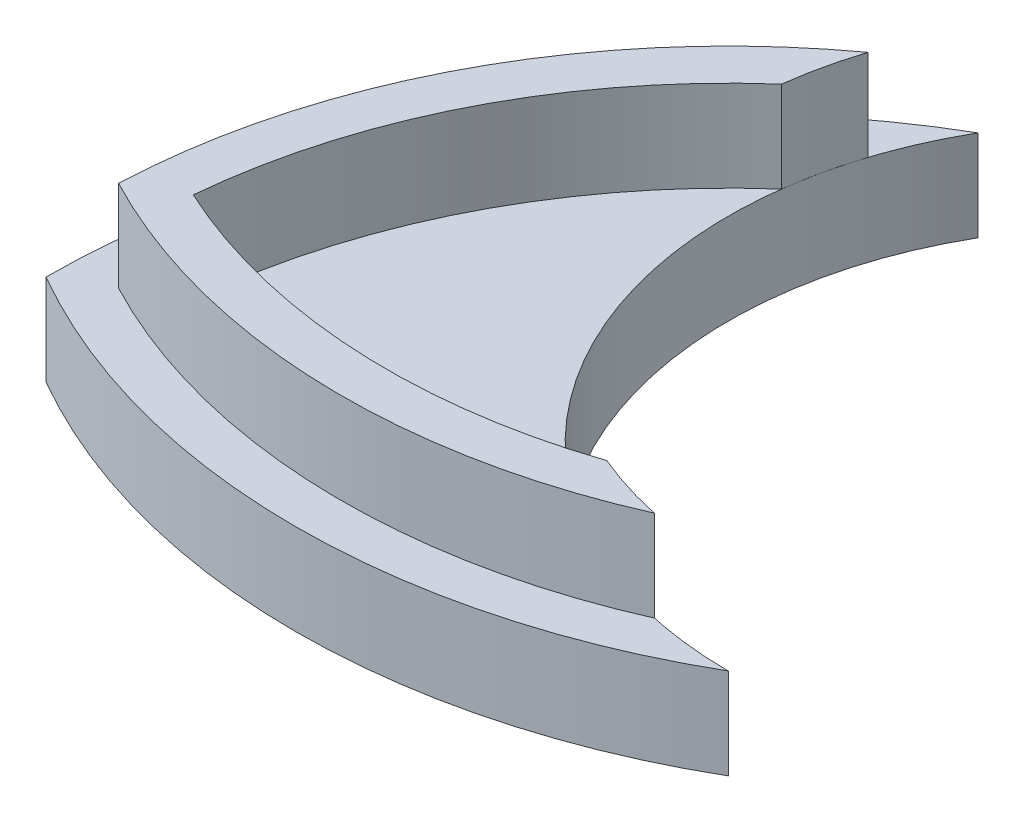
ISO-10303-21;
HEADER;
FILE_DESCRIPTION(('STEP AP214'),'2;1');
FILE_NAME('part.step','',(''),(''),'','','');
FILE_SCHEMA(('AUTOMOTIVE_DESIGN { 1 0 10303 214 1 1 1 1 }'));
ENDSEC;
DATA;
#1=APPLICATION_CONTEXT('core data for automotive mechanical design processes');
#2=APPLICATION_PROTOCOL_DEFINITION('international standard','automotive_design',2000,#1);
#3=PRODUCT_CONTEXT('',#1,'mechanical');
#4=PRODUCT('Part','Part','',(#3));
#5=PRODUCT_RELATED_PRODUCT_CATEGORY('part','',(#4));
#6=PRODUCT_DEFINITION_FORMATION('','',#4);
#7=PRODUCT_DEFINITION_CONTEXT('part definition',#1,'design');
#8=PRODUCT_DEFINITION('design','',#6,#7);
#9=PRODUCT_DEFINITION_SHAPE('','',#8);
#10=(LENGTH_UNIT() NAMED_UNIT(*) SI_UNIT(.MILLI.,.METRE.));
#11=(NAMED_UNIT(*) PLANE_ANGLE_UNIT() SI_UNIT($,.RADIAN.));
#12=(NAMED_UNIT(*) SI_UNIT($,.STERADIAN.) SOLID_ANGLE_UNIT());
#13=UNCERTAINTY_MEASURE_WITH_UNIT(LENGTH_MEASURE(1.E-05),#10,'distance_accuracy_value','');
#14=(GEOMETRIC_REPRESENTATION_CONTEXT(3) GLOBAL_UNCERTAINTY_ASSIGNED_CONTEXT((#13)) GLOBAL_UNIT_ASSIGNED_CONTEXT((#10,
#11,#12)) REPRESENTATION_CONTEXT('',''));
#15=CARTESIAN_POINT('',(0.,0.,0.));
#16=DIRECTION('',(0.,0.,1.));
#17=DIRECTION('',(1.,0.,0.));
#18=AXIS2_PLACEMENT_3D('',#15,#16,#17);
#19=CARTESIAN_POINT('',(-23.1873987103901,3.,-69.6040107675851));
#20=DIRECTION('',(0.,-1.,0.));
#21=DIRECTION('',(0.,0.,-1.));
#22=AXIS2_PLACEMENT_3D('',#19,#20,#21);
#23=PLANE('',#22);
#24=CARTESIAN_POINT('',(0.,3.,-50.094010767585));
#25=DIRECTION('',(0.,1.,0.));
#26=DIRECTION('',(0.,0.,1.));
#27=AXIS2_PLACEMENT_3D('',#24,#25,#26);
#28=CIRCLE('',#27,21.0166604983954);
#29=CARTESIAN_POINT('',(-12.3730420220271,3.,-67.0824730177702));
#30=VERTEX_POINT('',#29);
#31=CARTESIAN_POINT('',(-20.9983718015425,3.,-50.9705951554206));
#32=VERTEX_POINT('',#31);
#33=EDGE_CURVE('E133',#30,#32,#28,.T.);
#34=ORIENTED_EDGE('',*,*,#33,.F.);
#35=CARTESIAN_POINT('',(0.,3.,-63.0940107675848));
#36=DIRECTION('',(0.,-1.,0.));
#37=DIRECTION('',(0.,0.,-1.));
#38=AXIS2_PLACEMENT_3D('',#35,#36,#37);
#39=CIRCLE('',#38,13.);
#40=CARTESIAN_POINT('',(-12.8948631362501,3.,-64.7440121910322));
#41=VERTEX_POINT('',#40);
#42=EDGE_CURVE('E129',#30,#41,#39,.F.);
#43=ORIENTED_EDGE('',*,*,#42,.T.);
#44=CARTESIAN_POINT('',(0.,3.,-50.094010767585));
#45=DIRECTION('',(0.,1.,0.));
#46=DIRECTION('',(0.,0.,1.));
#47=AXIS2_PLACEMENT_3D('',#44,#45,#46);
#48=CIRCLE('',#47,19.5166604983954);
#49=CARTESIAN_POINT('',(-19.4354147151727,3.,-51.872968849968));
#50=VERTEX_POINT('',#49);
#51=EDGE_CURVE('E61',#41,#50,#48,.T.);
#52=ORIENTED_EDGE('',*,*,#51,.T.);
#53=CARTESIAN_POINT('',(-11.2583302491977,3.,-69.594010767585));
#54=DIRECTION('',(0.,1.,0.));
#55=DIRECTION('',(0.,0.,1.));
#56=AXIS2_PLACEMENT_3D('',#53,#54,#55);
#57=CIRCLE('',#56,19.5166604983954);
#58=CARTESIAN_POINT('',(-5.01848841913956,3.,-51.1017310015452));
#59=VERTEX_POINT('',#58);
#60=EDGE_CURVE('E117',#50,#59,#57,.T.);
#61=ORIENTED_EDGE('',*,*,#60,.T.);
#62=CARTESIAN_POINT('',(-2.73241138031828,3.,-50.3844109293245));
#63=VERTEX_POINT('',#62);
#64=EDGE_CURVE('E125',#59,#63,#39,.F.);
#65=ORIENTED_EDGE('',*,*,#64,.T.);
#66=CARTESIAN_POINT('',(-11.2583302491977,3.,-69.594010767585));
#67=DIRECTION('',(0.,1.,0.));
#68=DIRECTION('',(0.,0.,1.));
#69=AXIS2_PLACEMENT_3D('',#66,#67,#68);
#70=CIRCLE('',#69,21.0166604983954);
#71=EDGE_CURVE('E136',#32,#63,#70,.T.);
#72=ORIENTED_EDGE('',*,*,#71,.F.);
#73=EDGE_LOOP('',(#34,#43,#52,#61,#65,#72));
#74=FACE_BOUND('',#73,.T.);
#75=ADVANCED_FACE('F57',(#74),#23,.T.);
#76=CARTESIAN_POINT('',(0.,6.,-50.094010767585));
#77=DIRECTION('',(0.,-1.,0.));
#78=DIRECTION('',(0.,0.,-1.));
#79=AXIS2_PLACEMENT_3D('',#76,#77,#78);
#80=CYLINDRICAL_SURFACE('',#79,21.0166604983954);
#81=CARTESIAN_POINT('',(0.,6.,-50.094010767585));
#82=DIRECTION('',(0.,1.,0.));
#83=DIRECTION('',(0.,0.,1.));
#84=AXIS2_PLACEMENT_3D('',#81,#82,#83);
#85=CIRCLE('',#84,21.0166604983954);
#86=CARTESIAN_POINT('',(-12.3730420220271,6.,-67.0824730177702));
#87=VERTEX_POINT('',#86);
#88=CARTESIAN_POINT('',(-20.9983718015425,6.,-50.9705951554206));
#89=VERTEX_POINT('',#88);
#90=EDGE_CURVE('E139',#87,#89,#85,.T.);
#91=ORIENTED_EDGE('',*,*,#90,.F.);
#92=DIRECTION('',(0.,1.,0.));
#93=VECTOR('',#92,1.);
#94=CARTESIAN_POINT('',(-12.3730420220271,-3.005,-67.0824730177702));
#95=LINE('',#94,#93);
#96=EDGE_CURVE('E121',#87,#30,#95,.F.);
#97=ORIENTED_EDGE('',*,*,#96,.T.);
#98=ORIENTED_EDGE('',*,*,#33,.T.);
#99=DIRECTION('',(0.,-1.,0.));
#100=VECTOR('',#99,1.);
#101=CARTESIAN_POINT('',(-20.9983718015425,6.,-50.9705951554206));
#102=LINE('',#101,#100);
#103=EDGE_CURVE('E141',#89,#32,#102,.T.);
#104=ORIENTED_EDGE('',*,*,#103,.F.);
#105=EDGE_LOOP('',(#91,#97,#98,#104));
#106=FACE_BOUND('',#105,.T.);
#107=ADVANCED_FACE('F168',(#106),#80,.T.);
#108=CARTESIAN_POINT('',(0.,-12.01,-63.0940107675848));
#109=DIRECTION('',(0.,1.,0.));
#110=DIRECTION('',(0.,0.,1.));
#111=AXIS2_PLACEMENT_3D('',#108,#109,#110);
#112=CYLINDRICAL_SURFACE('',#111,13.);
#113=ORIENTED_EDGE('',*,*,#42,.F.);
#114=ORIENTED_EDGE('',*,*,#96,.F.);
#115=CARTESIAN_POINT('',(0.,6.,-63.0940107675848));
#116=DIRECTION('',(0.,1.,0.));
#117=DIRECTION('',(0.,0.,1.));
#118=AXIS2_PLACEMENT_3D('',#115,#116,#117);
#119=CIRCLE('',#118,13.);
#120=CARTESIAN_POINT('',(-12.8948631362501,6.,-64.7440121910322));
#121=VERTEX_POINT('',#120);
#122=EDGE_CURVE('E66',#87,#121,#119,.T.);
#123=ORIENTED_EDGE('',*,*,#122,.T.);
#124=DIRECTION('',(0.,1.,0.));
#125=VECTOR('',#124,1.);
#126=CARTESIAN_POINT('',(-12.8948631362501,-3.005,-64.7440121910322));
#127=LINE('',#126,#125);
#128=EDGE_CURVE('E80',#121,#41,#127,.F.);
#129=ORIENTED_EDGE('',*,*,#128,.T.);
#130=EDGE_LOOP('',(#113,#114,#123,#129));
#131=FACE_BOUND('',#130,.T.);
#132=ADVANCED_FACE('F59',(#131),#112,.F.);
#133=CARTESIAN_POINT('',(-5.62916512459886,6.,-59.844010767585));
#134=DIRECTION('',(0.,1.,0.));
#135=DIRECTION('',(0.,0.,1.));
#136=AXIS2_PLACEMENT_3D('',#133,#134,#135);
#137=PLANE('',#136);
#138=ORIENTED_EDGE('',*,*,#122,.F.);
#139=ORIENTED_EDGE('',*,*,#90,.T.);
#140=CARTESIAN_POINT('',(-11.2583302491977,6.,-69.594010767585));
#141=DIRECTION('',(0.,1.,0.));
#142=DIRECTION('',(0.,0.,1.));
#143=AXIS2_PLACEMENT_3D('',#140,#141,#142);
#144=CIRCLE('',#143,21.0166604983954);
#145=CARTESIAN_POINT('',(-2.73241138031828,6.,-50.3844109293245));
#146=VERTEX_POINT('',#145);
#147=EDGE_CURVE('E146',#89,#146,#144,.T.);
#148=ORIENTED_EDGE('',*,*,#147,.T.);
#149=CARTESIAN_POINT('',(-5.01848841913956,6.,-51.1017310015452));
#150=VERTEX_POINT('',#149);
#151=EDGE_CURVE('E12',#150,#146,#119,.T.);
#152=ORIENTED_EDGE('',*,*,#151,.F.);
#153=CARTESIAN_POINT('',(-11.2583302491977,6.,-69.594010767585));
#154=DIRECTION('',(0.,1.,0.));
#155=DIRECTION('',(0.,0.,1.));
#156=AXIS2_PLACEMENT_3D('',#153,#154,#155);
#157=CIRCLE('',#156,19.5166604983954);
#158=CARTESIAN_POINT('',(-19.4354147151727,6.,-51.872968849968));
#159=VERTEX_POINT('',#158);
#160=EDGE_CURVE('E119',#159,#150,#157,.T.);
#161=ORIENTED_EDGE('',*,*,#160,.F.);
#162=CARTESIAN_POINT('',(0.,6.,-50.094010767585));
#163=DIRECTION('',(0.,1.,0.));
#164=DIRECTION('',(0.,0.,1.));
#165=AXIS2_PLACEMENT_3D('',#162,#163,#164);
#166=CIRCLE('',#165,19.5166604983954);
#167=EDGE_CURVE('E149',#121,#159,#166,.T.);
#168=ORIENTED_EDGE('',*,*,#167,.F.);
#169=EDGE_LOOP('',(#138,#139,#148,#152,#161,#168));
#170=FACE_BOUND('',#169,.T.);
#171=ADVANCED_FACE('F158',(#170),#137,.T.);
#172=CARTESIAN_POINT('',(0.,6.,-50.094010767585));
#173=DIRECTION('',(0.,-1.,0.));
#174=DIRECTION('',(0.,0.,-1.));
#175=AXIS2_PLACEMENT_3D('',#172,#173,#174);
#176=CYLINDRICAL_SURFACE('',#175,19.5166604983954);
#177=ORIENTED_EDGE('',*,*,#128,.F.);
#178=ORIENTED_EDGE('',*,*,#167,.T.);
#179=DIRECTION('',(0.,-1.,0.));
#180=VECTOR('',#179,1.);
#181=CARTESIAN_POINT('',(-19.4354147151727,6.,-51.872968849968));
#182=LINE('',#181,#180);
#183=EDGE_CURVE('E137',#159,#50,#182,.T.);
#184=ORIENTED_EDGE('',*,*,#183,.T.);
#185=ORIENTED_EDGE('',*,*,#51,.F.);
#186=EDGE_LOOP('',(#177,#178,#184,#185));
#187=FACE_BOUND('',#186,.T.);
#188=ADVANCED_FACE('F159',(#187),#176,.F.);
#189=ORIENTED_EDGE('',*,*,#64,.F.);
#190=DIRECTION('',(0.,1.,0.));
#191=VECTOR('',#190,1.);
#192=CARTESIAN_POINT('',(-5.01848841913956,-3.005,-51.1017310015452));
#193=LINE('',#192,#191);
#194=EDGE_CURVE('E112',#59,#150,#193,.T.);
#195=ORIENTED_EDGE('',*,*,#194,.T.);
#196=ORIENTED_EDGE('',*,*,#151,.T.);
#197=DIRECTION('',(0.,1.,0.));
#198=VECTOR('',#197,1.);
#199=CARTESIAN_POINT('',(-2.73241138031828,-3.005,-50.3844109293245));
#200=LINE('',#199,#198);
#201=EDGE_CURVE('E127',#63,#146,#200,.T.);
#202=ORIENTED_EDGE('',*,*,#201,.F.);
#203=EDGE_LOOP('',(#189,#195,#196,#202));
#204=FACE_BOUND('',#203,.T.);
#205=ADVANCED_FACE('F126',(#204),#112,.F.);
#206=CARTESIAN_POINT('',(-11.2583302491977,6.,-69.594010767585));
#207=DIRECTION('',(0.,-1.,0.));
#208=DIRECTION('',(0.,0.,-1.));
#209=AXIS2_PLACEMENT_3D('',#206,#207,#208);
#210=CYLINDRICAL_SURFACE('',#209,19.5166604983954);
#211=ORIENTED_EDGE('',*,*,#194,.F.);
#212=ORIENTED_EDGE('',*,*,#60,.F.);
#213=ORIENTED_EDGE('',*,*,#183,.F.);
#214=ORIENTED_EDGE('',*,*,#160,.T.);
#215=EDGE_LOOP('',(#211,#212,#213,#214));
#216=FACE_BOUND('',#215,.T.);
#217=ADVANCED_FACE('F114',(#216),#210,.F.);
#218=CARTESIAN_POINT('',(-11.2583302491977,6.,-69.594010767585));
#219=DIRECTION('',(0.,-1.,0.));
#220=DIRECTION('',(0.,0.,-1.));
#221=AXIS2_PLACEMENT_3D('',#218,#219,#220);
#222=CYLINDRICAL_SURFACE('',#221,21.0166604983954);
#223=ORIENTED_EDGE('',*,*,#71,.T.);
#224=ORIENTED_EDGE('',*,*,#201,.T.);
#225=ORIENTED_EDGE('',*,*,#147,.F.);
#226=ORIENTED_EDGE('',*,*,#103,.T.);
#227=EDGE_LOOP('',(#223,#224,#225,#226));
#228=FACE_BOUND('',#227,.T.);
#229=ADVANCED_FACE('F176',(#228),#222,.T.);
#230=CLOSED_SHELL('',(#75,#107,#132,#171,#188,#205,#217,#229));
#231=MANIFOLD_SOLID_BREP('B2',#230);
#232=CARTESIAN_POINT('',(0.,-0.01,-50.094010767585));
#233=DIRECTION('',(0.,1.,0.));
#234=DIRECTION('',(0.,0.,1.));
#235=AXIS2_PLACEMENT_3D('',#232,#233,#234);
#236=CYLINDRICAL_SURFACE('',#235,22.5166604983954);
#237=DIRECTION('',(0.,1.,0.));
#238=VECTOR('',#237,1.);
#239=CARTESIAN_POINT('',(-22.5166604983954,-0.01,-50.094010767585));
#240=LINE('',#239,#238);
#241=CARTESIAN_POINT('',(-22.5166604983954,0.,-50.094010767585));
#242=VERTEX_POINT('',#241);
#243=CARTESIAN_POINT('',(-22.5166604983954,3.,-50.094010767585));
#244=VERTEX_POINT('',#243);
#245=EDGE_CURVE('E274',#242,#244,#240,.T.);
#246=ORIENTED_EDGE('',*,*,#245,.T.);
#247=CARTESIAN_POINT('',(0.,3.,-50.094010767585));
#248=DIRECTION('',(0.,1.,0.));
#249=DIRECTION('',(0.,0.,1.));
#250=AXIS2_PLACEMENT_3D('',#247,#248,#249);
#251=CIRCLE('',#250,22.5166604983954);
#252=CARTESIAN_POINT('',(-11.2583302491977,3.,-69.594010767585));
#253=VERTEX_POINT('',#252);
#254=EDGE_CURVE('E249',#253,#244,#251,.T.);
#255=ORIENTED_EDGE('',*,*,#254,.F.);
#256=DIRECTION('',(0.,-1.,0.));
#257=VECTOR('',#256,1.);
#258=CARTESIAN_POINT('',(-11.2583302491977,3.,-69.594010767585));
#259=LINE('',#258,#257);
#260=CARTESIAN_POINT('',(-11.2583302491977,0.,-69.594010767585));
#261=VERTEX_POINT('',#260);
#262=EDGE_CURVE('E55',#253,#261,#259,.T.);
#263=ORIENTED_EDGE('',*,*,#262,.T.);
#264=CARTESIAN_POINT('',(0.,0.,-50.094010767585));
#265=DIRECTION('',(0.,1.,0.));
#266=DIRECTION('',(0.,0.,1.));
#267=AXIS2_PLACEMENT_3D('',#264,#265,#266);
#268=CIRCLE('',#267,22.5166604983954);
#269=EDGE_CURVE('E256',#261,#242,#268,.T.);
#270=ORIENTED_EDGE('',*,*,#269,.T.);
#271=EDGE_LOOP('',(#246,#255,#263,#270));
#272=FACE_BOUND('',#271,.T.);
#273=ADVANCED_FACE('F231',(#272),#236,.T.);
#274=CARTESIAN_POINT('',(0.,0.,0.));
#275=DIRECTION('',(0.,1.,0.));
#276=DIRECTION('',(0.,0.,1.));
#277=AXIS2_PLACEMENT_3D('',#274,#275,#276);
#278=PLANE('',#277);
#279=CARTESIAN_POINT('',(0.,0.,-63.0940107675848));
#280=DIRECTION('',(0.,-1.,0.));
#281=DIRECTION('',(0.,0.,-1.));
#282=AXIS2_PLACEMENT_3D('',#279,#280,#281);
#283=CIRCLE('',#282,13.);
#284=CARTESIAN_POINT('',(0.,0.,-50.094010767585));
#285=VERTEX_POINT('',#284);
#286=EDGE_CURVE('E275',#285,#261,#283,.T.);
#287=ORIENTED_EDGE('',*,*,#286,.F.);
#288=CARTESIAN_POINT('',(-11.2583302491977,0.,-69.594010767585));
#289=DIRECTION('',(0.,1.,0.));
#290=DIRECTION('',(0.,0.,1.));
#291=AXIS2_PLACEMENT_3D('',#288,#289,#290);
#292=CIRCLE('',#291,22.5166604983954);
#293=EDGE_CURVE('E281',#242,#285,#292,.T.);
#294=ORIENTED_EDGE('',*,*,#293,.F.);
#295=ORIENTED_EDGE('',*,*,#269,.F.);
#296=EDGE_LOOP('',(#287,#294,#295));
#297=FACE_BOUND('',#296,.T.);
#298=ADVANCED_FACE('F233',(#297),#278,.F.);
#299=CARTESIAN_POINT('',(-11.2583302491977,-0.01,-69.594010767585));
#300=DIRECTION('',(0.,1.,0.));
#301=DIRECTION('',(0.,0.,1.));
#302=AXIS2_PLACEMENT_3D('',#299,#300,#301);
#303=CYLINDRICAL_SURFACE('',#302,22.5166604983954);
#304=ORIENTED_EDGE('',*,*,#245,.F.);
#305=ORIENTED_EDGE('',*,*,#293,.T.);
#306=DIRECTION('',(0.,-1.,0.));
#307=VECTOR('',#306,1.);
#308=CARTESIAN_POINT('',(0.,3.,-50.094010767585));
#309=LINE('',#308,#307);
#310=CARTESIAN_POINT('',(0.,3.,-50.094010767585));
#311=VERTEX_POINT('',#310);
#312=EDGE_CURVE('E235',#311,#285,#309,.T.);
#313=ORIENTED_EDGE('',*,*,#312,.F.);
#314=CARTESIAN_POINT('',(-11.2583302491977,3.,-69.594010767585));
#315=DIRECTION('',(0.,1.,0.));
#316=DIRECTION('',(0.,0.,1.));
#317=AXIS2_PLACEMENT_3D('',#314,#315,#316);
#318=CIRCLE('',#317,22.5166604983954);
#319=EDGE_CURVE('E241',#244,#311,#318,.T.);
#320=ORIENTED_EDGE('',*,*,#319,.F.);
#321=EDGE_LOOP('',(#304,#305,#313,#320));
#322=FACE_BOUND('',#321,.T.);
#323=ADVANCED_FACE('F294',(#322),#303,.T.);
#324=CARTESIAN_POINT('',(0.,-12.01,-63.0940107675848));
#325=DIRECTION('',(0.,1.,0.));
#326=DIRECTION('',(0.,0.,1.));
#327=AXIS2_PLACEMENT_3D('',#324,#325,#326);
#328=CYLINDRICAL_SURFACE('',#327,13.);
#329=ORIENTED_EDGE('',*,*,#262,.F.);
#330=CARTESIAN_POINT('',(0.,3.,-63.0940107675848));
#331=DIRECTION('',(0.,1.,0.));
#332=DIRECTION('',(0.,0.,1.));
#333=AXIS2_PLACEMENT_3D('',#330,#331,#332);
#334=CIRCLE('',#333,13.);
#335=EDGE_CURVE('E267',#253,#311,#334,.T.);
#336=ORIENTED_EDGE('',*,*,#335,.T.);
#337=ORIENTED_EDGE('',*,*,#312,.T.);
#338=ORIENTED_EDGE('',*,*,#286,.T.);
#339=EDGE_LOOP('',(#329,#336,#337,#338));
#340=FACE_BOUND('',#339,.T.);
#341=ADVANCED_FACE('F278',(#340),#328,.F.);
#342=CARTESIAN_POINT('',(0.,3.,0.));
#343=DIRECTION('',(0.,1.,0.));
#344=DIRECTION('',(0.,0.,1.));
#345=AXIS2_PLACEMENT_3D('',#342,#343,#344);
#346=PLANE('',#345);
#347=ORIENTED_EDGE('',*,*,#319,.T.);
#348=ORIENTED_EDGE('',*,*,#335,.F.);
#349=ORIENTED_EDGE('',*,*,#254,.T.);
#350=EDGE_LOOP('',(#347,#348,#349));
#351=FACE_BOUND('',#350,.T.);
#352=ADVANCED_FACE('F269',(#351),#346,.T.);
#353=CLOSED_SHELL('',(#273,#298,#323,#341,#352));
#354=MANIFOLD_SOLID_BREP('B6',#353);
#355=ADVANCED_BREP_SHAPE_REPRESENTATION('',(#18,#231,#354),#14);
#356=SHAPE_DEFINITION_REPRESENTATION(#9,#355);
ENDSEC;
END-ISO-10303-21;
